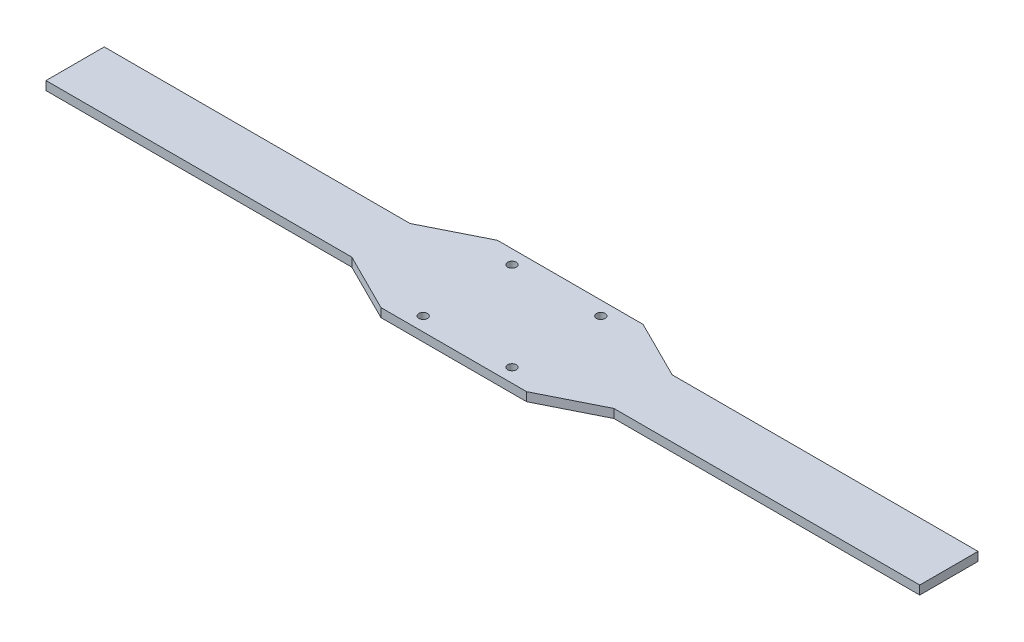
ISO-10303-21;
HEADER;
FILE_DESCRIPTION(('STEP AP214'),'2;1');
FILE_NAME('part.step','',(''),(''),'','','');
FILE_SCHEMA(('AUTOMOTIVE_DESIGN { 1 0 10303 214 1 1 1 1 }'));
ENDSEC;
DATA;
#1=APPLICATION_CONTEXT('core data for automotive mechanical design processes');
#2=APPLICATION_PROTOCOL_DEFINITION('international standard','automotive_design',2000,#1);
#3=PRODUCT_CONTEXT('',#1,'mechanical');
#4=PRODUCT('Part','Part','',(#3));
#5=PRODUCT_RELATED_PRODUCT_CATEGORY('part','',(#4));
#6=PRODUCT_DEFINITION_FORMATION('','',#4);
#7=PRODUCT_DEFINITION_CONTEXT('part definition',#1,'design');
#8=PRODUCT_DEFINITION('design','',#6,#7);
#9=PRODUCT_DEFINITION_SHAPE('','',#8);
#10=(LENGTH_UNIT() NAMED_UNIT(*) SI_UNIT(.MILLI.,.METRE.));
#11=(NAMED_UNIT(*) PLANE_ANGLE_UNIT() SI_UNIT($,.RADIAN.));
#12=(NAMED_UNIT(*) SI_UNIT($,.STERADIAN.) SOLID_ANGLE_UNIT());
#13=UNCERTAINTY_MEASURE_WITH_UNIT(LENGTH_MEASURE(1.E-05),#10,'distance_accuracy_value','');
#14=(GEOMETRIC_REPRESENTATION_CONTEXT(3) GLOBAL_UNCERTAINTY_ASSIGNED_CONTEXT((#13)) GLOBAL_UNIT_ASSIGNED_CONTEXT((#10,
#11,#12)) REPRESENTATION_CONTEXT('',''));
#15=CARTESIAN_POINT('',(0.,0.,0.));
#16=DIRECTION('',(0.,0.,1.));
#17=DIRECTION('',(1.,0.,0.));
#18=AXIS2_PLACEMENT_3D('',#15,#16,#17);
#19=CARTESIAN_POINT('',(0.,1.5,0.));
#20=DIRECTION('',(0.,-1.,0.));
#21=DIRECTION('',(0.,0.,-1.));
#22=AXIS2_PLACEMENT_3D('',#19,#20,#21);
#23=PLANE('',#22);
#24=DIRECTION('',(-0.894427190999916,0.,0.447213595499958));
#25=VECTOR('',#24,1.);
#26=CARTESIAN_POINT('',(-45.,1.5,-10.));
#27=LINE('',#26,#25);
#28=CARTESIAN_POINT('',(-25.,1.5,-20.));
#29=VERTEX_POINT('',#28);
#30=CARTESIAN_POINT('',(-45.,1.5,-10.));
#31=VERTEX_POINT('',#30);
#32=EDGE_CURVE('E201',#29,#31,#27,.T.);
#33=ORIENTED_EDGE('',*,*,#32,.T.);
#34=DIRECTION('',(-1.,0.,0.));
#35=VECTOR('',#34,1.);
#36=CARTESIAN_POINT('',(-150.,1.5,-9.99999999999999));
#37=LINE('',#36,#35);
#38=CARTESIAN_POINT('',(-150.,1.5,-9.99999999999999));
#39=VERTEX_POINT('',#38);
#40=EDGE_CURVE('E204',#31,#39,#37,.T.);
#41=ORIENTED_EDGE('',*,*,#40,.T.);
#42=DIRECTION('',(0.,0.,1.));
#43=VECTOR('',#42,1.);
#44=CARTESIAN_POINT('',(-150.,1.5,-20.));
#45=LINE('',#44,#43);
#46=CARTESIAN_POINT('',(-150.,1.5,10.));
#47=VERTEX_POINT('',#46);
#48=EDGE_CURVE('E161',#39,#47,#45,.T.);
#49=ORIENTED_EDGE('',*,*,#48,.T.);
#50=DIRECTION('',(1.,0.,0.));
#51=VECTOR('',#50,1.);
#52=CARTESIAN_POINT('',(-150.,1.5,10.));
#53=LINE('',#52,#51);
#54=CARTESIAN_POINT('',(-45.,1.5,10.));
#55=VERTEX_POINT('',#54);
#56=EDGE_CURVE('E214',#47,#55,#53,.T.);
#57=ORIENTED_EDGE('',*,*,#56,.T.);
#58=DIRECTION('',(0.894427190999916,0.,0.447213595499958));
#59=VECTOR('',#58,1.);
#60=CARTESIAN_POINT('',(-45.,1.5,10.));
#61=LINE('',#60,#59);
#62=CARTESIAN_POINT('',(-25.,1.5,20.));
#63=VERTEX_POINT('',#62);
#64=EDGE_CURVE('E160',#55,#63,#61,.T.);
#65=ORIENTED_EDGE('',*,*,#64,.T.);
#66=DIRECTION('',(1.,0.,0.));
#67=VECTOR('',#66,1.);
#68=CARTESIAN_POINT('',(150.,1.5,20.));
#69=LINE('',#68,#67);
#70=CARTESIAN_POINT('',(25.,1.5,20.));
#71=VERTEX_POINT('',#70);
#72=EDGE_CURVE('E151',#63,#71,#69,.T.);
#73=ORIENTED_EDGE('',*,*,#72,.T.);
#74=DIRECTION('',(0.894427190999916,0.,-0.447213595499958));
#75=VECTOR('',#74,1.);
#76=CARTESIAN_POINT('',(45.,1.5,10.));
#77=LINE('',#76,#75);
#78=CARTESIAN_POINT('',(45.,1.5,10.));
#79=VERTEX_POINT('',#78);
#80=EDGE_CURVE('E134',#71,#79,#77,.T.);
#81=ORIENTED_EDGE('',*,*,#80,.T.);
#82=DIRECTION('',(1.,0.,0.));
#83=VECTOR('',#82,1.);
#84=CARTESIAN_POINT('',(150.,1.5,10.));
#85=LINE('',#84,#83);
#86=CARTESIAN_POINT('',(150.,1.5,10.));
#87=VERTEX_POINT('',#86);
#88=EDGE_CURVE('E145',#79,#87,#85,.T.);
#89=ORIENTED_EDGE('',*,*,#88,.T.);
#90=DIRECTION('',(0.,0.,-1.));
#91=VECTOR('',#90,1.);
#92=CARTESIAN_POINT('',(150.,1.5,-20.));
#93=LINE('',#92,#91);
#94=CARTESIAN_POINT('',(150.,1.5,-10.0000000000001));
#95=VERTEX_POINT('',#94);
#96=EDGE_CURVE('E53',#87,#95,#93,.T.);
#97=ORIENTED_EDGE('',*,*,#96,.T.);
#98=DIRECTION('',(-1.,0.,0.));
#99=VECTOR('',#98,1.);
#100=CARTESIAN_POINT('',(150.,1.5,-10.0000000000001));
#101=LINE('',#100,#99);
#102=CARTESIAN_POINT('',(45.,1.5,-10.));
#103=VERTEX_POINT('',#102);
#104=EDGE_CURVE('E296',#95,#103,#101,.T.);
#105=ORIENTED_EDGE('',*,*,#104,.T.);
#106=DIRECTION('',(-0.894427190999916,0.,-0.447213595499958));
#107=VECTOR('',#106,1.);
#108=CARTESIAN_POINT('',(45.,1.5,-10.));
#109=LINE('',#108,#107);
#110=CARTESIAN_POINT('',(25.,1.5,-20.));
#111=VERTEX_POINT('',#110);
#112=EDGE_CURVE('E291',#103,#111,#109,.T.);
#113=ORIENTED_EDGE('',*,*,#112,.T.);
#114=DIRECTION('',(-1.,0.,0.));
#115=VECTOR('',#114,1.);
#116=CARTESIAN_POINT('',(150.,1.5,-20.));
#117=LINE('',#116,#115);
#118=EDGE_CURVE('E13',#111,#29,#117,.T.);
#119=ORIENTED_EDGE('',*,*,#118,.T.);
#120=EDGE_LOOP('',(#33,#41,#49,#57,#65,#73,#81,#89,#97,#105,#113,#119));
#121=FACE_BOUND('',#120,.T.);
#122=CARTESIAN_POINT('',(-15.25,1.5,-15.25));
#123=DIRECTION('',(0.,1.,0.));
#124=DIRECTION('',(0.,0.,1.));
#125=AXIS2_PLACEMENT_3D('',#122,#123,#124);
#126=CIRCLE('',#125,1.5);
#127=CARTESIAN_POINT('',(-15.25,1.5,-13.75));
#128=VERTEX_POINT('',#127);
#129=EDGE_CURVE('E172',#128,#128,#126,.T.);
#130=ORIENTED_EDGE('',*,*,#129,.F.);
#131=EDGE_LOOP('',(#130));
#132=FACE_BOUND('',#131,.T.);
#133=CARTESIAN_POINT('',(15.25,1.5,-15.25));
#134=DIRECTION('',(0.,1.,0.));
#135=DIRECTION('',(0.,0.,1.));
#136=AXIS2_PLACEMENT_3D('',#133,#134,#135);
#137=CIRCLE('',#136,1.5);
#138=CARTESIAN_POINT('',(15.25,1.5,-13.75));
#139=VERTEX_POINT('',#138);
#140=EDGE_CURVE('E241',#139,#139,#137,.T.);
#141=ORIENTED_EDGE('',*,*,#140,.F.);
#142=EDGE_LOOP('',(#141));
#143=FACE_BOUND('',#142,.T.);
#144=CARTESIAN_POINT('',(15.25,1.5,15.25));
#145=DIRECTION('',(0.,1.,0.));
#146=DIRECTION('',(0.,0.,1.));
#147=AXIS2_PLACEMENT_3D('',#144,#145,#146);
#148=CIRCLE('',#147,1.5);
#149=CARTESIAN_POINT('',(15.25,1.5,16.75));
#150=VERTEX_POINT('',#149);
#151=EDGE_CURVE('E235',#150,#150,#148,.T.);
#152=ORIENTED_EDGE('',*,*,#151,.F.);
#153=EDGE_LOOP('',(#152));
#154=FACE_BOUND('',#153,.T.);
#155=CARTESIAN_POINT('',(-15.25,1.5,15.25));
#156=DIRECTION('',(0.,1.,0.));
#157=DIRECTION('',(0.,0.,1.));
#158=AXIS2_PLACEMENT_3D('',#155,#156,#157);
#159=CIRCLE('',#158,1.5);
#160=CARTESIAN_POINT('',(-15.25,1.5,16.75));
#161=VERTEX_POINT('',#160);
#162=EDGE_CURVE('E229',#161,#161,#159,.T.);
#163=ORIENTED_EDGE('',*,*,#162,.F.);
#164=EDGE_LOOP('',(#163));
#165=FACE_BOUND('',#164,.T.);
#166=ADVANCED_FACE('F44',(#121,#132,#143,#154,#165),#23,.F.);
#167=CARTESIAN_POINT('',(0.,-1.5,0.));
#168=DIRECTION('',(0.,-1.,0.));
#169=DIRECTION('',(0.,0.,-1.));
#170=AXIS2_PLACEMENT_3D('',#167,#168,#169);
#171=PLANE('',#170);
#172=DIRECTION('',(-1.,0.,0.));
#173=VECTOR('',#172,1.);
#174=CARTESIAN_POINT('',(-150.,-1.5,-9.99999999999999));
#175=LINE('',#174,#173);
#176=CARTESIAN_POINT('',(-45.,-1.5,-10.));
#177=VERTEX_POINT('',#176);
#178=CARTESIAN_POINT('',(-150.,-1.5,-9.99999999999999));
#179=VERTEX_POINT('',#178);
#180=EDGE_CURVE('E198',#177,#179,#175,.T.);
#181=ORIENTED_EDGE('',*,*,#180,.F.);
#182=DIRECTION('',(-0.894427190999916,0.,0.447213595499958));
#183=VECTOR('',#182,1.);
#184=CARTESIAN_POINT('',(-45.,-1.5,-10.));
#185=LINE('',#184,#183);
#186=CARTESIAN_POINT('',(-25.,-1.5,-20.));
#187=VERTEX_POINT('',#186);
#188=EDGE_CURVE('E196',#187,#177,#185,.T.);
#189=ORIENTED_EDGE('',*,*,#188,.F.);
#190=DIRECTION('',(-1.,0.,0.));
#191=VECTOR('',#190,1.);
#192=CARTESIAN_POINT('',(150.,-1.5,-20.));
#193=LINE('',#192,#191);
#194=CARTESIAN_POINT('',(25.,-1.5,-20.));
#195=VERTEX_POINT('',#194);
#196=EDGE_CURVE('E48',#195,#187,#193,.T.);
#197=ORIENTED_EDGE('',*,*,#196,.F.);
#198=DIRECTION('',(-0.894427190999916,0.,-0.447213595499958));
#199=VECTOR('',#198,1.);
#200=CARTESIAN_POINT('',(45.,-1.5,-10.));
#201=LINE('',#200,#199);
#202=CARTESIAN_POINT('',(45.,-1.5,-10.));
#203=VERTEX_POINT('',#202);
#204=EDGE_CURVE('E194',#203,#195,#201,.T.);
#205=ORIENTED_EDGE('',*,*,#204,.F.);
#206=DIRECTION('',(-1.,0.,0.));
#207=VECTOR('',#206,1.);
#208=CARTESIAN_POINT('',(150.,-1.5,-10.0000000000001));
#209=LINE('',#208,#207);
#210=CARTESIAN_POINT('',(150.,-1.5,-10.0000000000001));
#211=VERTEX_POINT('',#210);
#212=EDGE_CURVE('E210',#211,#203,#209,.T.);
#213=ORIENTED_EDGE('',*,*,#212,.F.);
#214=DIRECTION('',(0.,0.,-1.));
#215=VECTOR('',#214,1.);
#216=CARTESIAN_POINT('',(150.,-1.5,-20.));
#217=LINE('',#216,#215);
#218=CARTESIAN_POINT('',(150.,-1.5,10.));
#219=VERTEX_POINT('',#218);
#220=EDGE_CURVE('E173',#219,#211,#217,.T.);
#221=ORIENTED_EDGE('',*,*,#220,.F.);
#222=DIRECTION('',(1.,0.,0.));
#223=VECTOR('',#222,1.);
#224=CARTESIAN_POINT('',(150.,-1.5,10.));
#225=LINE('',#224,#223);
#226=CARTESIAN_POINT('',(45.,-1.5,10.));
#227=VERTEX_POINT('',#226);
#228=EDGE_CURVE('E69',#227,#219,#225,.T.);
#229=ORIENTED_EDGE('',*,*,#228,.F.);
#230=DIRECTION('',(0.894427190999916,0.,-0.447213595499958));
#231=VECTOR('',#230,1.);
#232=CARTESIAN_POINT('',(45.,-1.5,10.));
#233=LINE('',#232,#231);
#234=CARTESIAN_POINT('',(25.,-1.5,20.));
#235=VERTEX_POINT('',#234);
#236=EDGE_CURVE('E294',#235,#227,#233,.T.);
#237=ORIENTED_EDGE('',*,*,#236,.F.);
#238=DIRECTION('',(1.,0.,0.));
#239=VECTOR('',#238,1.);
#240=CARTESIAN_POINT('',(150.,-1.5,20.));
#241=LINE('',#240,#239);
#242=CARTESIAN_POINT('',(-25.,-1.5,20.));
#243=VERTEX_POINT('',#242);
#244=EDGE_CURVE('E153',#243,#235,#241,.T.);
#245=ORIENTED_EDGE('',*,*,#244,.F.);
#246=DIRECTION('',(0.894427190999916,0.,0.447213595499958));
#247=VECTOR('',#246,1.);
#248=CARTESIAN_POINT('',(-45.,-1.5,10.));
#249=LINE('',#248,#247);
#250=CARTESIAN_POINT('',(-45.,-1.5,10.));
#251=VERTEX_POINT('',#250);
#252=EDGE_CURVE('E61',#251,#243,#249,.T.);
#253=ORIENTED_EDGE('',*,*,#252,.F.);
#254=DIRECTION('',(1.,0.,0.));
#255=VECTOR('',#254,1.);
#256=CARTESIAN_POINT('',(-150.,-1.5,10.));
#257=LINE('',#256,#255);
#258=CARTESIAN_POINT('',(-150.,-1.5,10.));
#259=VERTEX_POINT('',#258);
#260=EDGE_CURVE('E218',#259,#251,#257,.T.);
#261=ORIENTED_EDGE('',*,*,#260,.F.);
#262=DIRECTION('',(0.,0.,1.));
#263=VECTOR('',#262,1.);
#264=CARTESIAN_POINT('',(-150.,-1.5,-20.));
#265=LINE('',#264,#263);
#266=EDGE_CURVE('E169',#179,#259,#265,.T.);
#267=ORIENTED_EDGE('',*,*,#266,.F.);
#268=EDGE_LOOP('',(#181,#189,#197,#205,#213,#221,#229,#237,#245,#253,#261,#267));
#269=FACE_BOUND('',#268,.T.);
#270=CARTESIAN_POINT('',(15.25,-1.5,15.25));
#271=DIRECTION('',(0.,1.,0.));
#272=DIRECTION('',(0.,0.,1.));
#273=AXIS2_PLACEMENT_3D('',#270,#271,#272);
#274=CIRCLE('',#273,1.5);
#275=CARTESIAN_POINT('',(15.25,-1.5,16.75));
#276=VERTEX_POINT('',#275);
#277=EDGE_CURVE('E232',#276,#276,#274,.T.);
#278=ORIENTED_EDGE('',*,*,#277,.T.);
#279=EDGE_LOOP('',(#278));
#280=FACE_BOUND('',#279,.T.);
#281=CARTESIAN_POINT('',(-15.25,-1.5,-15.25));
#282=DIRECTION('',(0.,1.,0.));
#283=DIRECTION('',(0.,0.,1.));
#284=AXIS2_PLACEMENT_3D('',#281,#282,#283);
#285=CIRCLE('',#284,1.5);
#286=CARTESIAN_POINT('',(-15.25,-1.5,-13.75));
#287=VERTEX_POINT('',#286);
#288=EDGE_CURVE('E244',#287,#287,#285,.T.);
#289=ORIENTED_EDGE('',*,*,#288,.T.);
#290=EDGE_LOOP('',(#289));
#291=FACE_BOUND('',#290,.T.);
#292=CARTESIAN_POINT('',(15.25,-1.5,-15.25));
#293=DIRECTION('',(0.,1.,0.));
#294=DIRECTION('',(0.,0.,1.));
#295=AXIS2_PLACEMENT_3D('',#292,#293,#294);
#296=CIRCLE('',#295,1.5);
#297=CARTESIAN_POINT('',(15.25,-1.5,-13.75));
#298=VERTEX_POINT('',#297);
#299=EDGE_CURVE('E238',#298,#298,#296,.T.);
#300=ORIENTED_EDGE('',*,*,#299,.T.);
#301=EDGE_LOOP('',(#300));
#302=FACE_BOUND('',#301,.T.);
#303=CARTESIAN_POINT('',(-15.25,-1.5,15.25));
#304=DIRECTION('',(0.,1.,0.));
#305=DIRECTION('',(0.,0.,1.));
#306=AXIS2_PLACEMENT_3D('',#303,#304,#305);
#307=CIRCLE('',#306,1.5);
#308=CARTESIAN_POINT('',(-15.25,-1.5,16.75));
#309=VERTEX_POINT('',#308);
#310=EDGE_CURVE('E225',#309,#309,#307,.T.);
#311=ORIENTED_EDGE('',*,*,#310,.T.);
#312=EDGE_LOOP('',(#311));
#313=FACE_BOUND('',#312,.T.);
#314=ADVANCED_FACE('F191',(#269,#280,#291,#302,#313),#171,.T.);
#315=CARTESIAN_POINT('',(-150.,1.5,-20.));
#316=DIRECTION('',(1.,0.,0.));
#317=DIRECTION('',(0.,0.,-1.));
#318=AXIS2_PLACEMENT_3D('',#315,#316,#317);
#319=PLANE('',#318);
#320=ORIENTED_EDGE('',*,*,#48,.F.);
#321=DIRECTION('',(0.,-1.,0.));
#322=VECTOR('',#321,1.);
#323=CARTESIAN_POINT('',(-150.,1.5,-9.99999999999999));
#324=LINE('',#323,#322);
#325=EDGE_CURVE('E207',#39,#179,#324,.T.);
#326=ORIENTED_EDGE('',*,*,#325,.T.);
#327=ORIENTED_EDGE('',*,*,#266,.T.);
#328=DIRECTION('',(0.,-1.,0.));
#329=VECTOR('',#328,1.);
#330=CARTESIAN_POINT('',(-150.,1.5,10.));
#331=LINE('',#330,#329);
#332=EDGE_CURVE('E217',#47,#259,#331,.T.);
#333=ORIENTED_EDGE('',*,*,#332,.F.);
#334=EDGE_LOOP('',(#320,#326,#327,#333));
#335=FACE_BOUND('',#334,.T.);
#336=ADVANCED_FACE('F46',(#335),#319,.F.);
#337=CARTESIAN_POINT('',(150.,1.5,20.));
#338=DIRECTION('',(0.,0.,-1.));
#339=DIRECTION('',(-1.,0.,0.));
#340=AXIS2_PLACEMENT_3D('',#337,#338,#339);
#341=PLANE('',#340);
#342=ORIENTED_EDGE('',*,*,#244,.T.);
#343=DIRECTION('',(0.,-1.,0.));
#344=VECTOR('',#343,1.);
#345=CARTESIAN_POINT('',(25.,1.5,20.));
#346=LINE('',#345,#344);
#347=EDGE_CURVE('E138',#71,#235,#346,.T.);
#348=ORIENTED_EDGE('',*,*,#347,.F.);
#349=ORIENTED_EDGE('',*,*,#72,.F.);
#350=DIRECTION('',(0.,-1.,0.));
#351=VECTOR('',#350,1.);
#352=CARTESIAN_POINT('',(-25.,1.5,20.));
#353=LINE('',#352,#351);
#354=EDGE_CURVE('E223',#63,#243,#353,.T.);
#355=ORIENTED_EDGE('',*,*,#354,.T.);
#356=EDGE_LOOP('',(#342,#348,#349,#355));
#357=FACE_BOUND('',#356,.T.);
#358=ADVANCED_FACE('F150',(#357),#341,.F.);
#359=CARTESIAN_POINT('',(150.,1.5,-20.));
#360=DIRECTION('',(-1.,0.,0.));
#361=DIRECTION('',(0.,0.,1.));
#362=AXIS2_PLACEMENT_3D('',#359,#360,#361);
#363=PLANE('',#362);
#364=ORIENTED_EDGE('',*,*,#220,.T.);
#365=DIRECTION('',(0.,-1.,0.));
#366=VECTOR('',#365,1.);
#367=CARTESIAN_POINT('',(150.,1.5,-10.0000000000001));
#368=LINE('',#367,#366);
#369=EDGE_CURVE('E288',#95,#211,#368,.T.);
#370=ORIENTED_EDGE('',*,*,#369,.F.);
#371=ORIENTED_EDGE('',*,*,#96,.F.);
#372=DIRECTION('',(0.,-1.,0.));
#373=VECTOR('',#372,1.);
#374=CARTESIAN_POINT('',(150.,1.5,10.));
#375=LINE('',#374,#373);
#376=EDGE_CURVE('E221',#87,#219,#375,.T.);
#377=ORIENTED_EDGE('',*,*,#376,.T.);
#378=EDGE_LOOP('',(#364,#370,#371,#377));
#379=FACE_BOUND('',#378,.T.);
#380=ADVANCED_FACE('F265',(#379),#363,.F.);
#381=CARTESIAN_POINT('',(150.,1.5,-20.));
#382=DIRECTION('',(0.,0.,1.));
#383=DIRECTION('',(1.,0.,0.));
#384=AXIS2_PLACEMENT_3D('',#381,#382,#383);
#385=PLANE('',#384);
#386=ORIENTED_EDGE('',*,*,#196,.T.);
#387=DIRECTION('',(0.,-1.,0.));
#388=VECTOR('',#387,1.);
#389=CARTESIAN_POINT('',(-25.,1.5,-20.));
#390=LINE('',#389,#388);
#391=EDGE_CURVE('E185',#29,#187,#390,.T.);
#392=ORIENTED_EDGE('',*,*,#391,.F.);
#393=ORIENTED_EDGE('',*,*,#118,.F.);
#394=DIRECTION('',(0.,-1.,0.));
#395=VECTOR('',#394,1.);
#396=CARTESIAN_POINT('',(25.,1.5,-20.));
#397=LINE('',#396,#395);
#398=EDGE_CURVE('E186',#111,#195,#397,.T.);
#399=ORIENTED_EDGE('',*,*,#398,.T.);
#400=EDGE_LOOP('',(#386,#392,#393,#399));
#401=FACE_BOUND('',#400,.T.);
#402=ADVANCED_FACE('F183',(#401),#385,.F.);
#403=CARTESIAN_POINT('',(-15.25,1.5,-15.25));
#404=DIRECTION('',(0.,-1.,0.));
#405=DIRECTION('',(0.,0.,-1.));
#406=AXIS2_PLACEMENT_3D('',#403,#404,#405);
#407=CYLINDRICAL_SURFACE('',#406,1.5);
#408=ORIENTED_EDGE('',*,*,#129,.T.);
#409=EDGE_LOOP('',(#408));
#410=FACE_BOUND('',#409,.T.);
#411=ORIENTED_EDGE('',*,*,#288,.F.);
#412=EDGE_LOOP('',(#411));
#413=FACE_BOUND('',#412,.T.);
#414=ADVANCED_FACE('F253',(#410,#413),#407,.F.);
#415=CARTESIAN_POINT('',(15.25,1.5,-15.25));
#416=DIRECTION('',(0.,-1.,0.));
#417=DIRECTION('',(0.,0.,-1.));
#418=AXIS2_PLACEMENT_3D('',#415,#416,#417);
#419=CYLINDRICAL_SURFACE('',#418,1.5);
#420=ORIENTED_EDGE('',*,*,#140,.T.);
#421=EDGE_LOOP('',(#420));
#422=FACE_BOUND('',#421,.T.);
#423=ORIENTED_EDGE('',*,*,#299,.F.);
#424=EDGE_LOOP('',(#423));
#425=FACE_BOUND('',#424,.T.);
#426=ADVANCED_FACE('F255',(#422,#425),#419,.F.);
#427=CARTESIAN_POINT('',(15.25,1.5,15.25));
#428=DIRECTION('',(0.,-1.,0.));
#429=DIRECTION('',(0.,0.,-1.));
#430=AXIS2_PLACEMENT_3D('',#427,#428,#429);
#431=CYLINDRICAL_SURFACE('',#430,1.5);
#432=ORIENTED_EDGE('',*,*,#151,.T.);
#433=EDGE_LOOP('',(#432));
#434=FACE_BOUND('',#433,.T.);
#435=ORIENTED_EDGE('',*,*,#277,.F.);
#436=EDGE_LOOP('',(#435));
#437=FACE_BOUND('',#436,.T.);
#438=ADVANCED_FACE('F262',(#434,#437),#431,.F.);
#439=CARTESIAN_POINT('',(-15.25,1.5,15.25));
#440=DIRECTION('',(0.,-1.,0.));
#441=DIRECTION('',(0.,0.,-1.));
#442=AXIS2_PLACEMENT_3D('',#439,#440,#441);
#443=CYLINDRICAL_SURFACE('',#442,1.5);
#444=ORIENTED_EDGE('',*,*,#162,.T.);
#445=EDGE_LOOP('',(#444));
#446=FACE_BOUND('',#445,.T.);
#447=ORIENTED_EDGE('',*,*,#310,.F.);
#448=EDGE_LOOP('',(#447));
#449=FACE_BOUND('',#448,.T.);
#450=ADVANCED_FACE('F327',(#446,#449),#443,.F.);
#451=CARTESIAN_POINT('',(45.,1.5,-10.));
#452=DIRECTION('',(-0.447213595499958,0.,0.894427190999916));
#453=DIRECTION('',(0.894427190999916,0.,0.447213595499958));
#454=AXIS2_PLACEMENT_3D('',#451,#452,#453);
#455=PLANE('',#454);
#456=ORIENTED_EDGE('',*,*,#204,.T.);
#457=ORIENTED_EDGE('',*,*,#398,.F.);
#458=ORIENTED_EDGE('',*,*,#112,.F.);
#459=DIRECTION('',(0.,-1.,0.));
#460=VECTOR('',#459,1.);
#461=CARTESIAN_POINT('',(45.,1.5,-10.));
#462=LINE('',#461,#460);
#463=EDGE_CURVE('E290',#103,#203,#462,.T.);
#464=ORIENTED_EDGE('',*,*,#463,.T.);
#465=EDGE_LOOP('',(#456,#457,#458,#464));
#466=FACE_BOUND('',#465,.T.);
#467=ADVANCED_FACE('F330',(#466),#455,.F.);
#468=CARTESIAN_POINT('',(150.,1.5,-10.0000000000001));
#469=DIRECTION('',(0.,0.,1.));
#470=DIRECTION('',(1.,0.,0.));
#471=AXIS2_PLACEMENT_3D('',#468,#469,#470);
#472=PLANE('',#471);
#473=ORIENTED_EDGE('',*,*,#212,.T.);
#474=ORIENTED_EDGE('',*,*,#463,.F.);
#475=ORIENTED_EDGE('',*,*,#104,.F.);
#476=ORIENTED_EDGE('',*,*,#369,.T.);
#477=EDGE_LOOP('',(#473,#474,#475,#476));
#478=FACE_BOUND('',#477,.T.);
#479=ADVANCED_FACE('F309',(#478),#472,.F.);
#480=CARTESIAN_POINT('',(-150.,1.5,-9.99999999999999));
#481=DIRECTION('',(0.,0.,1.));
#482=DIRECTION('',(1.,0.,0.));
#483=AXIS2_PLACEMENT_3D('',#480,#481,#482);
#484=PLANE('',#483);
#485=ORIENTED_EDGE('',*,*,#180,.T.);
#486=ORIENTED_EDGE('',*,*,#325,.F.);
#487=ORIENTED_EDGE('',*,*,#40,.F.);
#488=DIRECTION('',(0.,-1.,0.));
#489=VECTOR('',#488,1.);
#490=CARTESIAN_POINT('',(-45.,1.5,-10.));
#491=LINE('',#490,#489);
#492=EDGE_CURVE('E211',#31,#177,#491,.T.);
#493=ORIENTED_EDGE('',*,*,#492,.T.);
#494=EDGE_LOOP('',(#485,#486,#487,#493));
#495=FACE_BOUND('',#494,.T.);
#496=ADVANCED_FACE('F365',(#495),#484,.F.);
#497=CARTESIAN_POINT('',(-45.,1.5,-10.));
#498=DIRECTION('',(0.447213595499958,0.,0.894427190999916));
#499=DIRECTION('',(0.894427190999916,0.,-0.447213595499958));
#500=AXIS2_PLACEMENT_3D('',#497,#498,#499);
#501=PLANE('',#500);
#502=ORIENTED_EDGE('',*,*,#188,.T.);
#503=ORIENTED_EDGE('',*,*,#492,.F.);
#504=ORIENTED_EDGE('',*,*,#32,.F.);
#505=ORIENTED_EDGE('',*,*,#391,.T.);
#506=EDGE_LOOP('',(#502,#503,#504,#505));
#507=FACE_BOUND('',#506,.T.);
#508=ADVANCED_FACE('F324',(#507),#501,.F.);
#509=CARTESIAN_POINT('',(150.,1.5,10.));
#510=DIRECTION('',(0.,0.,-1.));
#511=DIRECTION('',(-1.,0.,0.));
#512=AXIS2_PLACEMENT_3D('',#509,#510,#511);
#513=PLANE('',#512);
#514=ORIENTED_EDGE('',*,*,#228,.T.);
#515=ORIENTED_EDGE('',*,*,#376,.F.);
#516=ORIENTED_EDGE('',*,*,#88,.F.);
#517=DIRECTION('',(0.,-1.,0.));
#518=VECTOR('',#517,1.);
#519=CARTESIAN_POINT('',(45.,1.5,10.));
#520=LINE('',#519,#518);
#521=EDGE_CURVE('E140',#79,#227,#520,.T.);
#522=ORIENTED_EDGE('',*,*,#521,.T.);
#523=EDGE_LOOP('',(#514,#515,#516,#522));
#524=FACE_BOUND('',#523,.T.);
#525=ADVANCED_FACE('F321',(#524),#513,.F.);
#526=CARTESIAN_POINT('',(45.,1.5,10.));
#527=DIRECTION('',(-0.447213595499958,0.,-0.894427190999916));
#528=DIRECTION('',(-0.894427190999916,0.,0.447213595499958));
#529=AXIS2_PLACEMENT_3D('',#526,#527,#528);
#530=PLANE('',#529);
#531=ORIENTED_EDGE('',*,*,#236,.T.);
#532=ORIENTED_EDGE('',*,*,#521,.F.);
#533=ORIENTED_EDGE('',*,*,#80,.F.);
#534=ORIENTED_EDGE('',*,*,#347,.T.);
#535=EDGE_LOOP('',(#531,#532,#533,#534));
#536=FACE_BOUND('',#535,.T.);
#537=ADVANCED_FACE('F137',(#536),#530,.F.);
#538=CARTESIAN_POINT('',(-45.,1.5,10.));
#539=DIRECTION('',(0.447213595499958,0.,-0.894427190999916));
#540=DIRECTION('',(-0.894427190999916,0.,-0.447213595499958));
#541=AXIS2_PLACEMENT_3D('',#538,#539,#540);
#542=PLANE('',#541);
#543=ORIENTED_EDGE('',*,*,#252,.T.);
#544=ORIENTED_EDGE('',*,*,#354,.F.);
#545=ORIENTED_EDGE('',*,*,#64,.F.);
#546=DIRECTION('',(0.,-1.,0.));
#547=VECTOR('',#546,1.);
#548=CARTESIAN_POINT('',(-45.,1.5,10.));
#549=LINE('',#548,#547);
#550=EDGE_CURVE('E226',#55,#251,#549,.T.);
#551=ORIENTED_EDGE('',*,*,#550,.T.);
#552=EDGE_LOOP('',(#543,#544,#545,#551));
#553=FACE_BOUND('',#552,.T.);
#554=ADVANCED_FACE('F313',(#553),#542,.F.);
#555=CARTESIAN_POINT('',(-150.,1.5,10.));
#556=DIRECTION('',(0.,0.,-1.));
#557=DIRECTION('',(-1.,0.,0.));
#558=AXIS2_PLACEMENT_3D('',#555,#556,#557);
#559=PLANE('',#558);
#560=ORIENTED_EDGE('',*,*,#260,.T.);
#561=ORIENTED_EDGE('',*,*,#550,.F.);
#562=ORIENTED_EDGE('',*,*,#56,.F.);
#563=ORIENTED_EDGE('',*,*,#332,.T.);
#564=EDGE_LOOP('',(#560,#561,#562,#563));
#565=FACE_BOUND('',#564,.T.);
#566=ADVANCED_FACE('F312',(#565),#559,.F.);
#567=CLOSED_SHELL('',(#166,#314,#336,#358,#380,#402,#414,#426,#438,#450,#467,#479,#496,#508,
#525,#537,#554,#566));
#568=MANIFOLD_SOLID_BREP('B2',#567);
#569=ADVANCED_BREP_SHAPE_REPRESENTATION('',(#18,#568),#14);
#570=SHAPE_DEFINITION_REPRESENTATION(#9,#569);
ENDSEC;
END-ISO-10303-21;
